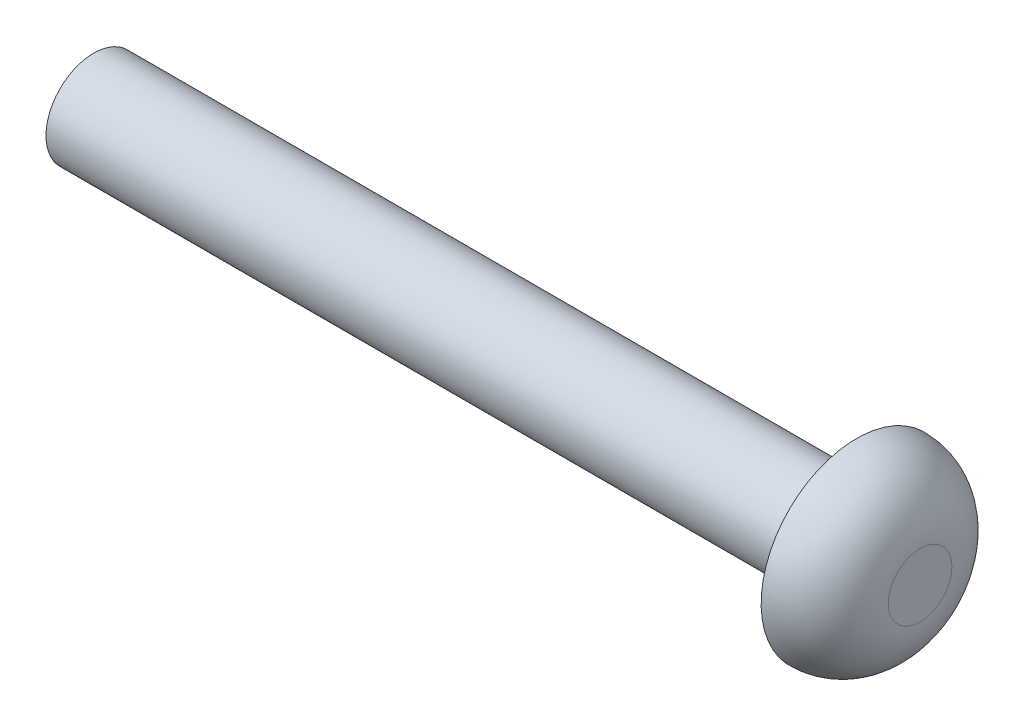
ISO-10303-21;
HEADER;
FILE_DESCRIPTION(('STEP AP214'),'2;1');
FILE_NAME('part.step','',(''),(''),'','','');
FILE_SCHEMA(('AUTOMOTIVE_DESIGN { 1 0 10303 214 1 1 1 1 }'));
ENDSEC;
DATA;
#1=APPLICATION_CONTEXT('core data for automotive mechanical design processes');
#2=APPLICATION_PROTOCOL_DEFINITION('international standard','automotive_design',2000,#1);
#3=PRODUCT_CONTEXT('',#1,'mechanical');
#4=PRODUCT('Part','Part','',(#3));
#5=PRODUCT_RELATED_PRODUCT_CATEGORY('part','',(#4));
#6=PRODUCT_DEFINITION_FORMATION('','',#4);
#7=PRODUCT_DEFINITION_CONTEXT('part definition',#1,'design');
#8=PRODUCT_DEFINITION('design','',#6,#7);
#9=PRODUCT_DEFINITION_SHAPE('','',#8);
#10=(LENGTH_UNIT() NAMED_UNIT(*) SI_UNIT(.MILLI.,.METRE.));
#11=(NAMED_UNIT(*) PLANE_ANGLE_UNIT() SI_UNIT($,.RADIAN.));
#12=(NAMED_UNIT(*) SI_UNIT($,.STERADIAN.) SOLID_ANGLE_UNIT());
#13=UNCERTAINTY_MEASURE_WITH_UNIT(LENGTH_MEASURE(1.E-05),#10,'distance_accuracy_value','');
#14=(GEOMETRIC_REPRESENTATION_CONTEXT(3) GLOBAL_UNCERTAINTY_ASSIGNED_CONTEXT((#13)) GLOBAL_UNIT_ASSIGNED_CONTEXT((#10,
#11,#12)) REPRESENTATION_CONTEXT('',''));
#15=CARTESIAN_POINT('',(0.,0.,0.));
#16=DIRECTION('',(0.,0.,1.));
#17=DIRECTION('',(1.,0.,0.));
#18=AXIS2_PLACEMENT_3D('',#15,#16,#17);
#19=CARTESIAN_POINT('',(0.,0.,0.));
#20=DIRECTION('',(1.,0.,0.));
#21=DIRECTION('',(0.,1.,0.));
#22=AXIS2_PLACEMENT_3D('',#19,#20,#21);
#23=PLANE('',#22);
#24=CARTESIAN_POINT('',(0.,0.,0.));
#25=DIRECTION('',(-1.,0.,0.));
#26=DIRECTION('',(0.,-1.,0.));
#27=AXIS2_PLACEMENT_3D('',#24,#25,#26);
#28=CIRCLE('',#27,6.);
#29=CARTESIAN_POINT('',(0.,-6.,0.));
#30=VERTEX_POINT('',#29);
#31=EDGE_CURVE('E10',#30,#30,#28,.T.);
#32=ORIENTED_EDGE('',*,*,#31,.T.);
#33=EDGE_LOOP('',(#32));
#34=FACE_BOUND('',#33,.T.);
#35=ADVANCED_FACE('F35',(#34),#23,.F.);
#36=CARTESIAN_POINT('',(0.,0.,0.));
#37=DIRECTION('',(-1.,0.,0.));
#38=DIRECTION('',(0.,-1.,0.));
#39=AXIS2_PLACEMENT_3D('',#36,#37,#38);
#40=CYLINDRICAL_SURFACE('',#39,6.);
#41=ORIENTED_EDGE('',*,*,#31,.F.);
#42=EDGE_LOOP('',(#41));
#43=FACE_BOUND('',#42,.T.);
#44=CARTESIAN_POINT('',(96.,0.,0.));
#45=DIRECTION('',(-1.,0.,0.));
#46=DIRECTION('',(0.,-1.,0.));
#47=AXIS2_PLACEMENT_3D('',#44,#45,#46);
#48=CIRCLE('',#47,6.);
#49=CARTESIAN_POINT('',(96.,-6.,0.));
#50=VERTEX_POINT('',#49);
#51=EDGE_CURVE('E41',#50,#50,#48,.T.);
#52=ORIENTED_EDGE('',*,*,#51,.T.);
#53=EDGE_LOOP('',(#52));
#54=FACE_BOUND('',#53,.T.);
#55=ADVANCED_FACE('F67',(#43,#54),#40,.T.);
#56=CARTESIAN_POINT('',(96.,6.,0.));
#57=DIRECTION('',(1.,0.,0.));
#58=DIRECTION('',(0.,1.,0.));
#59=AXIS2_PLACEMENT_3D('',#56,#57,#58);
#60=PLANE('',#59);
#61=ORIENTED_EDGE('',*,*,#51,.F.);
#62=EDGE_LOOP('',(#61));
#63=FACE_BOUND('',#62,.T.);
#64=CARTESIAN_POINT('',(96.,0.,0.));
#65=DIRECTION('',(-1.,0.,0.));
#66=DIRECTION('',(0.,-1.,0.));
#67=AXIS2_PLACEMENT_3D('',#64,#65,#66);
#68=CIRCLE('',#67,12.);
#69=CARTESIAN_POINT('',(96.,-12.,0.));
#70=VERTEX_POINT('',#69);
#71=EDGE_CURVE('E45',#70,#70,#68,.T.);
#72=ORIENTED_EDGE('',*,*,#71,.T.);
#73=EDGE_LOOP('',(#72));
#74=FACE_BOUND('',#73,.T.);
#75=ADVANCED_FACE('F63',(#63,#74),#60,.F.);
#76=CARTESIAN_POINT('',(96.,0.,0.));
#77=DIRECTION('',(-1.,0.,0.));
#78=DIRECTION('',(0.,-1.,0.));
#79=AXIS2_PLACEMENT_3D('',#76,#77,#78);
#80=DEGENERATE_TOROIDAL_SURFACE('',#79,4.,8.,.T.);
#81=ORIENTED_EDGE('',*,*,#71,.F.);
#82=EDGE_LOOP('',(#81));
#83=FACE_BOUND('',#82,.T.);
#84=CARTESIAN_POINT('',(104.,0.,0.));
#85=DIRECTION('',(-1.,0.,0.));
#86=DIRECTION('',(0.,-1.,0.));
#87=AXIS2_PLACEMENT_3D('',#84,#85,#86);
#88=CIRCLE('',#87,4.);
#89=CARTESIAN_POINT('',(104.,-4.,0.));
#90=VERTEX_POINT('',#89);
#91=EDGE_CURVE('E49',#90,#90,#88,.T.);
#92=ORIENTED_EDGE('',*,*,#91,.T.);
#93=EDGE_LOOP('',(#92));
#94=FACE_BOUND('',#93,.T.);
#95=ADVANCED_FACE('F55',(#83,#94),#80,.T.);
#96=CARTESIAN_POINT('',(104.,4.,0.));
#97=DIRECTION('',(-1.,0.,0.));
#98=DIRECTION('',(0.,-1.,0.));
#99=AXIS2_PLACEMENT_3D('',#96,#97,#98);
#100=PLANE('',#99);
#101=ORIENTED_EDGE('',*,*,#91,.F.);
#102=EDGE_LOOP('',(#101));
#103=FACE_BOUND('',#102,.T.);
#104=ADVANCED_FACE('F57',(#103),#100,.F.);
#105=CLOSED_SHELL('',(#35,#55,#75,#95,#104));
#106=MANIFOLD_SOLID_BREP('B2',#105);
#107=ADVANCED_BREP_SHAPE_REPRESENTATION('',(#18,#106),#14);
#108=SHAPE_DEFINITION_REPRESENTATION(#9,#107);
ENDSEC;
END-ISO-10303-21;
